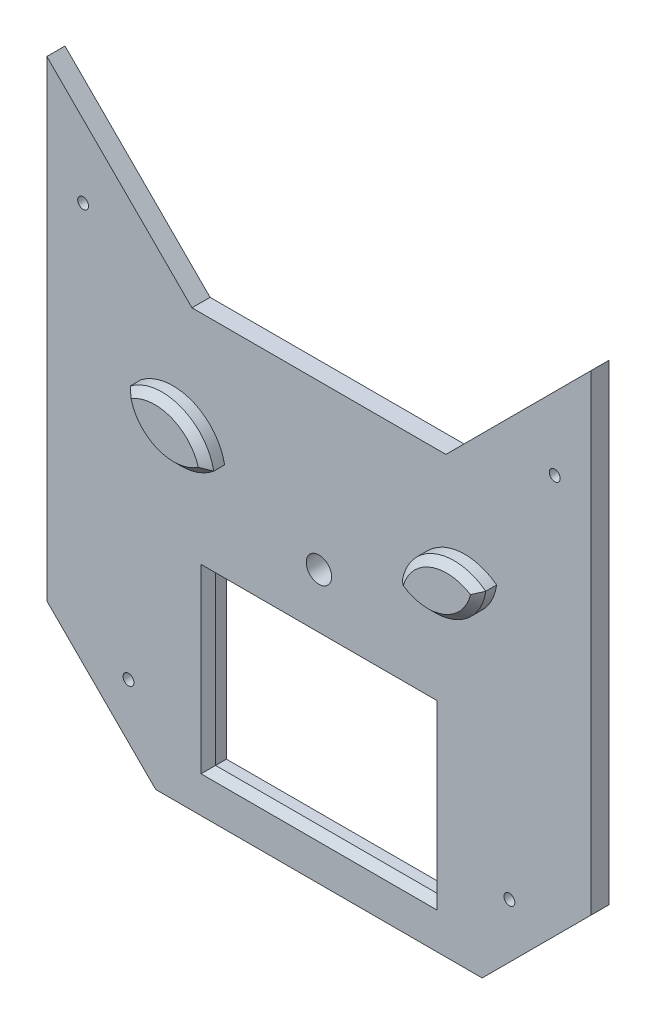
ISO-10303-21;
HEADER;
FILE_DESCRIPTION(('STEP AP214'),'2;1');
FILE_NAME('part.step','',(''),(''),'','','');
FILE_SCHEMA(('AUTOMOTIVE_DESIGN { 1 0 10303 214 1 1 1 1 }'));
ENDSEC;
DATA;
#1=APPLICATION_CONTEXT('core data for automotive mechanical design processes');
#2=APPLICATION_PROTOCOL_DEFINITION('international standard','automotive_design',2000,#1);
#3=PRODUCT_CONTEXT('',#1,'mechanical');
#4=PRODUCT('Part','Part','',(#3));
#5=PRODUCT_RELATED_PRODUCT_CATEGORY('part','',(#4));
#6=PRODUCT_DEFINITION_FORMATION('','',#4);
#7=PRODUCT_DEFINITION_CONTEXT('part definition',#1,'design');
#8=PRODUCT_DEFINITION('design','',#6,#7);
#9=PRODUCT_DEFINITION_SHAPE('','',#8);
#10=(LENGTH_UNIT() NAMED_UNIT(*) SI_UNIT(.MILLI.,.METRE.));
#11=(NAMED_UNIT(*) PLANE_ANGLE_UNIT() SI_UNIT($,.RADIAN.));
#12=(NAMED_UNIT(*) SI_UNIT($,.STERADIAN.) SOLID_ANGLE_UNIT());
#13=UNCERTAINTY_MEASURE_WITH_UNIT(LENGTH_MEASURE(1.E-05),#10,'distance_accuracy_value','');
#14=(GEOMETRIC_REPRESENTATION_CONTEXT(3) GLOBAL_UNCERTAINTY_ASSIGNED_CONTEXT((#13)) GLOBAL_UNIT_ASSIGNED_CONTEXT((#10,
#11,#12)) REPRESENTATION_CONTEXT('',''));
#15=CARTESIAN_POINT('',(0.,0.,0.));
#16=DIRECTION('',(0.,0.,1.));
#17=DIRECTION('',(1.,0.,0.));
#18=AXIS2_PLACEMENT_3D('',#15,#16,#17);
#19=CARTESIAN_POINT('',(0.,0.,5.));
#20=DIRECTION('',(0.,0.,-1.));
#21=DIRECTION('',(-1.,0.,0.));
#22=AXIS2_PLACEMENT_3D('',#19,#20,#21);
#23=PLANE('',#22);
#24=CARTESIAN_POINT('',(-52.5,-27.5,5.));
#25=DIRECTION('',(0.,0.,1.));
#26=DIRECTION('',(1.,0.,0.));
#27=AXIS2_PLACEMENT_3D('',#24,#25,#26);
#28=CIRCLE('',#27,1.5);
#29=CARTESIAN_POINT('',(-51.,-27.5,5.));
#30=VERTEX_POINT('',#29);
#31=EDGE_CURVE('E222',#30,#30,#28,.T.);
#32=ORIENTED_EDGE('',*,*,#31,.F.);
#33=EDGE_LOOP('',(#32));
#34=FACE_BOUND('',#33,.T.);
#35=CARTESIAN_POINT('',(65.0000000000002,80.,5.));
#36=DIRECTION('',(0.,0.,-1.));
#37=DIRECTION('',(-1.,0.,0.));
#38=AXIS2_PLACEMENT_3D('',#35,#36,#37);
#39=CIRCLE('',#38,1.5);
#40=CARTESIAN_POINT('',(63.5000000000002,80.,5.));
#41=VERTEX_POINT('',#40);
#42=EDGE_CURVE('E565',#41,#41,#39,.T.);
#43=ORIENTED_EDGE('',*,*,#42,.T.);
#44=EDGE_LOOP('',(#43));
#45=FACE_BOUND('',#44,.T.);
#46=DIRECTION('',(1.,0.,0.));
#47=VECTOR('',#46,1.);
#48=CARTESIAN_POINT('',(30.5,10.,5.));
#49=LINE('',#48,#47);
#50=CARTESIAN_POINT('',(-32.5,10.,5.));
#51=VERTEX_POINT('',#50);
#52=CARTESIAN_POINT('',(32.5,10.,5.));
#53=VERTEX_POINT('',#52);
#54=EDGE_CURVE('E436',#51,#53,#49,.T.);
#55=ORIENTED_EDGE('',*,*,#54,.T.);
#56=DIRECTION('',(0.,-1.,0.));
#57=VECTOR('',#56,1.);
#58=CARTESIAN_POINT('',(32.5,-38.,5.));
#59=LINE('',#58,#57);
#60=CARTESIAN_POINT('',(32.5,-40.,5.));
#61=VERTEX_POINT('',#60);
#62=EDGE_CURVE('E445',#53,#61,#59,.T.);
#63=ORIENTED_EDGE('',*,*,#62,.T.);
#64=DIRECTION('',(-1.,0.,0.));
#65=VECTOR('',#64,1.);
#66=CARTESIAN_POINT('',(-30.5,-40.,5.));
#67=LINE('',#66,#65);
#68=CARTESIAN_POINT('',(-32.5,-40.,5.));
#69=VERTEX_POINT('',#68);
#70=EDGE_CURVE('E442',#61,#69,#67,.T.);
#71=ORIENTED_EDGE('',*,*,#70,.T.);
#72=DIRECTION('',(0.,1.,0.));
#73=VECTOR('',#72,1.);
#74=CARTESIAN_POINT('',(-32.5,8.00000000000003,5.));
#75=LINE('',#74,#73);
#76=EDGE_CURVE('E439',#69,#51,#75,.T.);
#77=ORIENTED_EDGE('',*,*,#76,.T.);
#78=EDGE_LOOP('',(#55,#63,#71,#77));
#79=FACE_BOUND('',#78,.T.);
#80=CARTESIAN_POINT('',(0.,25.,5.));
#81=DIRECTION('',(0.,0.,1.));
#82=DIRECTION('',(1.,0.,0.));
#83=AXIS2_PLACEMENT_3D('',#80,#81,#82);
#84=CIRCLE('',#83,3.5);
#85=CARTESIAN_POINT('',(3.50000000000001,25.,5.));
#86=VERTEX_POINT('',#85);
#87=EDGE_CURVE('E196',#86,#86,#84,.T.);
#88=ORIENTED_EDGE('',*,*,#87,.F.);
#89=EDGE_LOOP('',(#88));
#90=FACE_BOUND('',#89,.T.);
#91=CARTESIAN_POINT('',(40.2421070756714,34.2774302497248,5.));
#92=DIRECTION('',(0.,0.,1.));
#93=DIRECTION('',(-1.,0.,0.));
#94=AXIS2_PLACEMENT_3D('',#91,#92,#93);
#95=CIRCLE('',#94,14.5000000000001);
#96=CARTESIAN_POINT('',(49.,45.8337839794267,5.));
#97=VERTEX_POINT('',#96);
#98=CARTESIAN_POINT('',(26.,37.,5.));
#99=VERTEX_POINT('',#98);
#100=EDGE_CURVE('E187',#97,#99,#95,.T.);
#101=ORIENTED_EDGE('',*,*,#100,.F.);
#102=CARTESIAN_POINT('',(35.0432527727272,47.8133791982382,5.));
#103=DIRECTION('',(0.,0.,1.));
#104=DIRECTION('',(1.,0.,0.));
#105=AXIS2_PLACEMENT_3D('',#102,#103,#104);
#106=CIRCLE('',#105,14.0964389260667);
#107=EDGE_CURVE('E190',#99,#97,#106,.T.);
#108=ORIENTED_EDGE('',*,*,#107,.F.);
#109=EDGE_LOOP('',(#101,#108));
#110=FACE_BOUND('',#109,.T.);
#111=DIRECTION('',(0.,1.,0.));
#112=VECTOR('',#111,1.);
#113=CARTESIAN_POINT('',(75.,70.,5.));
#114=LINE('',#113,#112);
#115=CARTESIAN_POINT('',(75.0000000000001,-19.9999999999999,5.));
#116=VERTEX_POINT('',#115);
#117=CARTESIAN_POINT('',(75.,110.,5.));
#118=VERTEX_POINT('',#117);
#119=EDGE_CURVE('E271',#116,#118,#114,.T.);
#120=ORIENTED_EDGE('',*,*,#119,.T.);
#121=DIRECTION('',(-0.707106781186545,-0.70710678118655,0.));
#122=VECTOR('',#121,1.);
#123=CARTESIAN_POINT('',(75.,110.,5.));
#124=LINE('',#123,#122);
#125=CARTESIAN_POINT('',(35.0000000000004,70.,5.));
#126=VERTEX_POINT('',#125);
#127=EDGE_CURVE('E275',#118,#126,#124,.T.);
#128=ORIENTED_EDGE('',*,*,#127,.T.);
#129=DIRECTION('',(-1.,0.,0.));
#130=VECTOR('',#129,1.);
#131=CARTESIAN_POINT('',(-35.0000000000004,70.0000000000001,5.));
#132=LINE('',#131,#130);
#133=CARTESIAN_POINT('',(-35.0000000000004,70.0000000000001,5.));
#134=VERTEX_POINT('',#133);
#135=EDGE_CURVE('E279',#126,#134,#132,.T.);
#136=ORIENTED_EDGE('',*,*,#135,.T.);
#137=DIRECTION('',(-0.707106781186545,0.70710678118655,0.));
#138=VECTOR('',#137,1.);
#139=CARTESIAN_POINT('',(-75.,110.,5.));
#140=LINE('',#139,#138);
#141=CARTESIAN_POINT('',(-75.,110.,5.));
#142=VERTEX_POINT('',#141);
#143=EDGE_CURVE('E282',#134,#142,#140,.T.);
#144=ORIENTED_EDGE('',*,*,#143,.T.);
#145=DIRECTION('',(0.,-1.,0.));
#146=VECTOR('',#145,1.);
#147=CARTESIAN_POINT('',(-75.,70.,5.));
#148=LINE('',#147,#146);
#149=CARTESIAN_POINT('',(-75.,-20.,5.));
#150=VERTEX_POINT('',#149);
#151=EDGE_CURVE('E285',#142,#150,#148,.T.);
#152=ORIENTED_EDGE('',*,*,#151,.T.);
#153=DIRECTION('',(0.707106781186547,-0.707106781186548,0.));
#154=VECTOR('',#153,1.);
#155=CARTESIAN_POINT('',(-75.,-20.,5.));
#156=LINE('',#155,#154);
#157=CARTESIAN_POINT('',(-45.,-50.,5.));
#158=VERTEX_POINT('',#157);
#159=EDGE_CURVE('E288',#150,#158,#156,.T.);
#160=ORIENTED_EDGE('',*,*,#159,.T.);
#161=DIRECTION('',(1.,0.,0.));
#162=VECTOR('',#161,1.);
#163=CARTESIAN_POINT('',(-45.,-50.,5.));
#164=LINE('',#163,#162);
#165=CARTESIAN_POINT('',(45.0000000000001,-50.,5.));
#166=VERTEX_POINT('',#165);
#167=EDGE_CURVE('E291',#158,#166,#164,.T.);
#168=ORIENTED_EDGE('',*,*,#167,.T.);
#169=DIRECTION('',(0.707106781186547,0.707106781186548,0.));
#170=VECTOR('',#169,1.);
#171=CARTESIAN_POINT('',(75.0000000000001,-19.9999999999999,5.));
#172=LINE('',#171,#170);
#173=EDGE_CURVE('E294',#166,#116,#172,.T.);
#174=ORIENTED_EDGE('',*,*,#173,.T.);
#175=EDGE_LOOP('',(#120,#128,#136,#144,#152,#160,#168,#174));
#176=FACE_BOUND('',#175,.T.);
#177=CARTESIAN_POINT('',(-35.0432527727272,47.8133791982382,5.));
#178=DIRECTION('',(0.,0.,1.));
#179=DIRECTION('',(-1.,0.,0.));
#180=AXIS2_PLACEMENT_3D('',#177,#178,#179);
#181=CIRCLE('',#180,14.0964389260667);
#182=CARTESIAN_POINT('',(-49.,45.8337839794267,5.));
#183=VERTEX_POINT('',#182);
#184=CARTESIAN_POINT('',(-26.,37.,5.));
#185=VERTEX_POINT('',#184);
#186=EDGE_CURVE('E206',#183,#185,#181,.T.);
#187=ORIENTED_EDGE('',*,*,#186,.F.);
#188=CARTESIAN_POINT('',(-40.2421070756713,34.2774302497248,5.));
#189=DIRECTION('',(0.,0.,1.));
#190=DIRECTION('',(1.,0.,0.));
#191=AXIS2_PLACEMENT_3D('',#188,#189,#190);
#192=CIRCLE('',#191,14.5);
#193=EDGE_CURVE('E266',#185,#183,#192,.T.);
#194=ORIENTED_EDGE('',*,*,#193,.F.);
#195=EDGE_LOOP('',(#187,#194));
#196=FACE_BOUND('',#195,.T.);
#197=CARTESIAN_POINT('',(52.5000000000001,-27.4999999999999,5.));
#198=DIRECTION('',(0.,0.,-1.));
#199=DIRECTION('',(-1.,0.,0.));
#200=AXIS2_PLACEMENT_3D('',#197,#198,#199);
#201=CIRCLE('',#200,1.5);
#202=CARTESIAN_POINT('',(51.0000000000001,-27.4999999999999,5.));
#203=VERTEX_POINT('',#202);
#204=EDGE_CURVE('E561',#203,#203,#201,.T.);
#205=ORIENTED_EDGE('',*,*,#204,.T.);
#206=EDGE_LOOP('',(#205));
#207=FACE_BOUND('',#206,.T.);
#208=CARTESIAN_POINT('',(-65.0000000000002,80.,5.));
#209=DIRECTION('',(0.,0.,1.));
#210=DIRECTION('',(1.,0.,0.));
#211=AXIS2_PLACEMENT_3D('',#208,#209,#210);
#212=CIRCLE('',#211,1.5);
#213=CARTESIAN_POINT('',(-63.5000000000002,80.,5.));
#214=VERTEX_POINT('',#213);
#215=EDGE_CURVE('E473',#214,#214,#212,.T.);
#216=ORIENTED_EDGE('',*,*,#215,.F.);
#217=EDGE_LOOP('',(#216));
#218=FACE_BOUND('',#217,.T.);
#219=ADVANCED_FACE('F49',(#34,#45,#79,#90,#110,#176,#196,#207,#218),#23,.F.);
#220=CARTESIAN_POINT('',(0.,0.,0.));
#221=DIRECTION('',(0.,0.,-1.));
#222=DIRECTION('',(-1.,0.,0.));
#223=AXIS2_PLACEMENT_3D('',#220,#221,#222);
#224=PLANE('',#223);
#225=CARTESIAN_POINT('',(52.5000000000001,-27.4999999999999,0.));
#226=DIRECTION('',(0.,0.,-1.));
#227=DIRECTION('',(-1.,0.,0.));
#228=AXIS2_PLACEMENT_3D('',#225,#226,#227);
#229=CIRCLE('',#228,1.5);
#230=CARTESIAN_POINT('',(51.0000000000001,-27.4999999999999,0.));
#231=VERTEX_POINT('',#230);
#232=EDGE_CURVE('E476',#231,#231,#229,.F.);
#233=ORIENTED_EDGE('',*,*,#232,.T.);
#234=EDGE_LOOP('',(#233));
#235=FACE_BOUND('',#234,.T.);
#236=CARTESIAN_POINT('',(65.0000000000002,80.,0.));
#237=DIRECTION('',(0.,0.,-1.));
#238=DIRECTION('',(-1.,0.,0.));
#239=AXIS2_PLACEMENT_3D('',#236,#237,#238);
#240=CIRCLE('',#239,1.5);
#241=CARTESIAN_POINT('',(63.5000000000002,80.,0.));
#242=VERTEX_POINT('',#241);
#243=EDGE_CURVE('E468',#242,#242,#240,.F.);
#244=ORIENTED_EDGE('',*,*,#243,.T.);
#245=EDGE_LOOP('',(#244));
#246=FACE_BOUND('',#245,.T.);
#247=DIRECTION('',(-0.707106781186545,-0.70710678118655,0.));
#248=VECTOR('',#247,1.);
#249=CARTESIAN_POINT('',(75.,110.,0.));
#250=LINE('',#249,#248);
#251=CARTESIAN_POINT('',(75.,110.,0.));
#252=VERTEX_POINT('',#251);
#253=CARTESIAN_POINT('',(35.0000000000004,70.,0.));
#254=VERTEX_POINT('',#253);
#255=EDGE_CURVE('E270',#252,#254,#250,.T.);
#256=ORIENTED_EDGE('',*,*,#255,.F.);
#257=DIRECTION('',(0.,1.,0.));
#258=VECTOR('',#257,1.);
#259=CARTESIAN_POINT('',(75.0000000000001,-19.9999999999999,0.));
#260=LINE('',#259,#258);
#261=CARTESIAN_POINT('',(75.0000000000001,-19.9999999999999,0.));
#262=VERTEX_POINT('',#261);
#263=EDGE_CURVE('E276',#262,#252,#260,.T.);
#264=ORIENTED_EDGE('',*,*,#263,.F.);
#265=DIRECTION('',(0.707106781186547,0.707106781186548,0.));
#266=VECTOR('',#265,1.);
#267=CARTESIAN_POINT('',(75.0000000000001,-19.9999999999999,0.));
#268=LINE('',#267,#266);
#269=CARTESIAN_POINT('',(45.0000000000001,-50.,0.));
#270=VERTEX_POINT('',#269);
#271=EDGE_CURVE('E317',#270,#262,#268,.T.);
#272=ORIENTED_EDGE('',*,*,#271,.F.);
#273=DIRECTION('',(1.,0.,0.));
#274=VECTOR('',#273,1.);
#275=CARTESIAN_POINT('',(-45.,-50.,0.));
#276=LINE('',#275,#274);
#277=CARTESIAN_POINT('',(-45.,-50.,0.));
#278=VERTEX_POINT('',#277);
#279=EDGE_CURVE('E314',#278,#270,#276,.T.);
#280=ORIENTED_EDGE('',*,*,#279,.F.);
#281=DIRECTION('',(0.707106781186547,-0.707106781186548,0.));
#282=VECTOR('',#281,1.);
#283=CARTESIAN_POINT('',(-75.,-20.,0.));
#284=LINE('',#283,#282);
#285=CARTESIAN_POINT('',(-75.,-20.,0.));
#286=VERTEX_POINT('',#285);
#287=EDGE_CURVE('E311',#286,#278,#284,.T.);
#288=ORIENTED_EDGE('',*,*,#287,.F.);
#289=DIRECTION('',(0.,-1.,0.));
#290=VECTOR('',#289,1.);
#291=CARTESIAN_POINT('',(-75.,-20.,0.));
#292=LINE('',#291,#290);
#293=CARTESIAN_POINT('',(-75.,110.,0.));
#294=VERTEX_POINT('',#293);
#295=EDGE_CURVE('E308',#294,#286,#292,.T.);
#296=ORIENTED_EDGE('',*,*,#295,.F.);
#297=DIRECTION('',(-0.707106781186545,0.70710678118655,0.));
#298=VECTOR('',#297,1.);
#299=CARTESIAN_POINT('',(-75.,110.,0.));
#300=LINE('',#299,#298);
#301=CARTESIAN_POINT('',(-35.0000000000004,70.0000000000001,0.));
#302=VERTEX_POINT('',#301);
#303=EDGE_CURVE('E304',#302,#294,#300,.T.);
#304=ORIENTED_EDGE('',*,*,#303,.F.);
#305=DIRECTION('',(-1.,0.,0.));
#306=VECTOR('',#305,1.);
#307=CARTESIAN_POINT('',(-35.0000000000004,70.0000000000001,0.));
#308=LINE('',#307,#306);
#309=EDGE_CURVE('E301',#254,#302,#308,.T.);
#310=ORIENTED_EDGE('',*,*,#309,.F.);
#311=EDGE_LOOP('',(#256,#264,#272,#280,#288,#296,#304,#310));
#312=FACE_BOUND('',#311,.T.);
#313=CARTESIAN_POINT('',(0.,25.,0.));
#314=DIRECTION('',(0.,0.,1.));
#315=DIRECTION('',(1.,0.,0.));
#316=AXIS2_PLACEMENT_3D('',#313,#314,#315);
#317=CIRCLE('',#316,3.5);
#318=CARTESIAN_POINT('',(3.50000000000001,25.,0.));
#319=VERTEX_POINT('',#318);
#320=EDGE_CURVE('E256',#319,#319,#317,.T.);
#321=ORIENTED_EDGE('',*,*,#320,.T.);
#322=EDGE_LOOP('',(#321));
#323=FACE_BOUND('',#322,.T.);
#324=DIRECTION('',(1.,0.,0.));
#325=VECTOR('',#324,1.);
#326=CARTESIAN_POINT('',(-30.5,-38.,0.));
#327=LINE('',#326,#325);
#328=CARTESIAN_POINT('',(-30.5,-38.,0.));
#329=VERTEX_POINT('',#328);
#330=CARTESIAN_POINT('',(30.5,-38.,0.));
#331=VERTEX_POINT('',#330);
#332=EDGE_CURVE('E240',#329,#331,#327,.T.);
#333=ORIENTED_EDGE('',*,*,#332,.T.);
#334=DIRECTION('',(0.,1.,0.));
#335=VECTOR('',#334,1.);
#336=CARTESIAN_POINT('',(30.5,-38.,0.));
#337=LINE('',#336,#335);
#338=CARTESIAN_POINT('',(30.5,8.00000000000003,0.));
#339=VERTEX_POINT('',#338);
#340=EDGE_CURVE('E227',#331,#339,#337,.T.);
#341=ORIENTED_EDGE('',*,*,#340,.T.);
#342=DIRECTION('',(-1.,0.,0.));
#343=VECTOR('',#342,1.);
#344=CARTESIAN_POINT('',(-30.5,8.00000000000003,0.));
#345=LINE('',#344,#343);
#346=CARTESIAN_POINT('',(-30.5,8.00000000000003,0.));
#347=VERTEX_POINT('',#346);
#348=EDGE_CURVE('E232',#339,#347,#345,.T.);
#349=ORIENTED_EDGE('',*,*,#348,.T.);
#350=DIRECTION('',(0.,-1.,0.));
#351=VECTOR('',#350,1.);
#352=CARTESIAN_POINT('',(-30.5,-38.,0.));
#353=LINE('',#352,#351);
#354=EDGE_CURVE('E236',#347,#329,#353,.T.);
#355=ORIENTED_EDGE('',*,*,#354,.T.);
#356=EDGE_LOOP('',(#333,#341,#349,#355));
#357=FACE_BOUND('',#356,.T.);
#358=CARTESIAN_POINT('',(-52.5,-27.5,0.));
#359=DIRECTION('',(0.,0.,-1.));
#360=DIRECTION('',(-1.,0.,0.));
#361=AXIS2_PLACEMENT_3D('',#358,#359,#360);
#362=CIRCLE('',#361,1.5);
#363=CARTESIAN_POINT('',(-54.,-27.5,0.));
#364=VERTEX_POINT('',#363);
#365=EDGE_CURVE('E472',#364,#364,#362,.T.);
#366=ORIENTED_EDGE('',*,*,#365,.F.);
#367=EDGE_LOOP('',(#366));
#368=FACE_BOUND('',#367,.T.);
#369=CARTESIAN_POINT('',(-65.0000000000002,80.,0.));
#370=DIRECTION('',(0.,0.,-1.));
#371=DIRECTION('',(-1.,0.,0.));
#372=AXIS2_PLACEMENT_3D('',#369,#370,#371);
#373=CIRCLE('',#372,1.5);
#374=CARTESIAN_POINT('',(-66.5000000000002,80.,0.));
#375=VERTEX_POINT('',#374);
#376=EDGE_CURVE('E54',#375,#375,#373,.T.);
#377=ORIENTED_EDGE('',*,*,#376,.F.);
#378=EDGE_LOOP('',(#377));
#379=FACE_BOUND('',#378,.T.);
#380=ADVANCED_FACE('F488',(#235,#246,#312,#323,#357,#368,#379),#224,.T.);
#381=CARTESIAN_POINT('',(75.,110.,5.));
#382=DIRECTION('',(0.70710678118655,-0.707106781186545,0.));
#383=DIRECTION('',(0.707106781186545,0.70710678118655,0.));
#384=AXIS2_PLACEMENT_3D('',#381,#382,#383);
#385=PLANE('',#384);
#386=ORIENTED_EDGE('',*,*,#255,.T.);
#387=DIRECTION('',(0.,0.,-1.));
#388=VECTOR('',#387,1.);
#389=CARTESIAN_POINT('',(35.0000000000004,70.,5.));
#390=LINE('',#389,#388);
#391=EDGE_CURVE('E345',#126,#254,#390,.T.);
#392=ORIENTED_EDGE('',*,*,#391,.F.);
#393=ORIENTED_EDGE('',*,*,#127,.F.);
#394=DIRECTION('',(0.,0.,-1.));
#395=VECTOR('',#394,1.);
#396=CARTESIAN_POINT('',(75.,110.,5.));
#397=LINE('',#396,#395);
#398=EDGE_CURVE('E349',#118,#252,#397,.T.);
#399=ORIENTED_EDGE('',*,*,#398,.T.);
#400=EDGE_LOOP('',(#386,#392,#393,#399));
#401=FACE_BOUND('',#400,.T.);
#402=ADVANCED_FACE('F490',(#401),#385,.F.);
#403=CARTESIAN_POINT('',(-35.0000000000004,70.0000000000001,5.));
#404=DIRECTION('',(0.,-1.,0.));
#405=DIRECTION('',(1.,0.,0.));
#406=AXIS2_PLACEMENT_3D('',#403,#404,#405);
#407=PLANE('',#406);
#408=ORIENTED_EDGE('',*,*,#309,.T.);
#409=DIRECTION('',(0.,0.,-1.));
#410=VECTOR('',#409,1.);
#411=CARTESIAN_POINT('',(-35.0000000000004,70.0000000000001,5.));
#412=LINE('',#411,#410);
#413=EDGE_CURVE('E341',#134,#302,#412,.T.);
#414=ORIENTED_EDGE('',*,*,#413,.F.);
#415=ORIENTED_EDGE('',*,*,#135,.F.);
#416=ORIENTED_EDGE('',*,*,#391,.T.);
#417=EDGE_LOOP('',(#408,#414,#415,#416));
#418=FACE_BOUND('',#417,.T.);
#419=ADVANCED_FACE('F497',(#418),#407,.F.);
#420=CARTESIAN_POINT('',(-75.,110.,5.));
#421=DIRECTION('',(-0.70710678118655,-0.707106781186545,0.));
#422=DIRECTION('',(0.707106781186545,-0.70710678118655,0.));
#423=AXIS2_PLACEMENT_3D('',#420,#421,#422);
#424=PLANE('',#423);
#425=ORIENTED_EDGE('',*,*,#303,.T.);
#426=DIRECTION('',(0.,0.,-1.));
#427=VECTOR('',#426,1.);
#428=CARTESIAN_POINT('',(-75.,110.,5.));
#429=LINE('',#428,#427);
#430=EDGE_CURVE('E337',#142,#294,#429,.T.);
#431=ORIENTED_EDGE('',*,*,#430,.F.);
#432=ORIENTED_EDGE('',*,*,#143,.F.);
#433=ORIENTED_EDGE('',*,*,#413,.T.);
#434=EDGE_LOOP('',(#425,#431,#432,#433));
#435=FACE_BOUND('',#434,.T.);
#436=ADVANCED_FACE('F524',(#435),#424,.F.);
#437=CARTESIAN_POINT('',(-75.,-20.,5.));
#438=DIRECTION('',(1.,0.,0.));
#439=DIRECTION('',(0.,0.,-1.));
#440=AXIS2_PLACEMENT_3D('',#437,#438,#439);
#441=PLANE('',#440);
#442=ORIENTED_EDGE('',*,*,#295,.T.);
#443=DIRECTION('',(0.,0.,-1.));
#444=VECTOR('',#443,1.);
#445=CARTESIAN_POINT('',(-75.,-20.,5.));
#446=LINE('',#445,#444);
#447=EDGE_CURVE('E333',#150,#286,#446,.T.);
#448=ORIENTED_EDGE('',*,*,#447,.F.);
#449=ORIENTED_EDGE('',*,*,#151,.F.);
#450=ORIENTED_EDGE('',*,*,#430,.T.);
#451=EDGE_LOOP('',(#442,#448,#449,#450));
#452=FACE_BOUND('',#451,.T.);
#453=ADVANCED_FACE('F520',(#452),#441,.F.);
#454=CARTESIAN_POINT('',(-75.,-20.,5.));
#455=DIRECTION('',(0.707106781186548,0.707106781186547,0.));
#456=DIRECTION('',(-0.707106781186547,0.707106781186548,0.));
#457=AXIS2_PLACEMENT_3D('',#454,#455,#456);
#458=PLANE('',#457);
#459=ORIENTED_EDGE('',*,*,#287,.T.);
#460=DIRECTION('',(0.,0.,-1.));
#461=VECTOR('',#460,1.);
#462=CARTESIAN_POINT('',(-45.,-50.,5.));
#463=LINE('',#462,#461);
#464=EDGE_CURVE('E329',#158,#278,#463,.T.);
#465=ORIENTED_EDGE('',*,*,#464,.F.);
#466=ORIENTED_EDGE('',*,*,#159,.F.);
#467=ORIENTED_EDGE('',*,*,#447,.T.);
#468=EDGE_LOOP('',(#459,#465,#466,#467));
#469=FACE_BOUND('',#468,.T.);
#470=ADVANCED_FACE('F516',(#469),#458,.F.);
#471=CARTESIAN_POINT('',(-45.,-50.,5.));
#472=DIRECTION('',(0.,1.,0.));
#473=DIRECTION('',(-1.,0.,0.));
#474=AXIS2_PLACEMENT_3D('',#471,#472,#473);
#475=PLANE('',#474);
#476=ORIENTED_EDGE('',*,*,#279,.T.);
#477=DIRECTION('',(0.,0.,-1.));
#478=VECTOR('',#477,1.);
#479=CARTESIAN_POINT('',(45.0000000000001,-50.,5.));
#480=LINE('',#479,#478);
#481=EDGE_CURVE('E325',#166,#270,#480,.T.);
#482=ORIENTED_EDGE('',*,*,#481,.F.);
#483=ORIENTED_EDGE('',*,*,#167,.F.);
#484=ORIENTED_EDGE('',*,*,#464,.T.);
#485=EDGE_LOOP('',(#476,#482,#483,#484));
#486=FACE_BOUND('',#485,.T.);
#487=ADVANCED_FACE('F512',(#486),#475,.F.);
#488=CARTESIAN_POINT('',(75.0000000000001,-19.9999999999999,5.));
#489=DIRECTION('',(-0.707106781186548,0.707106781186547,0.));
#490=DIRECTION('',(-0.707106781186547,-0.707106781186548,0.));
#491=AXIS2_PLACEMENT_3D('',#488,#489,#490);
#492=PLANE('',#491);
#493=ORIENTED_EDGE('',*,*,#271,.T.);
#494=DIRECTION('',(0.,0.,-1.));
#495=VECTOR('',#494,1.);
#496=CARTESIAN_POINT('',(75.0000000000001,-19.9999999999999,5.));
#497=LINE('',#496,#495);
#498=EDGE_CURVE('E298',#116,#262,#497,.T.);
#499=ORIENTED_EDGE('',*,*,#498,.F.);
#500=ORIENTED_EDGE('',*,*,#173,.F.);
#501=ORIENTED_EDGE('',*,*,#481,.T.);
#502=EDGE_LOOP('',(#493,#499,#500,#501));
#503=FACE_BOUND('',#502,.T.);
#504=ADVANCED_FACE('F508',(#503),#492,.F.);
#505=CARTESIAN_POINT('',(75.0000000000001,-19.9999999999999,5.));
#506=DIRECTION('',(-1.,0.,0.));
#507=DIRECTION('',(0.,-1.,0.));
#508=AXIS2_PLACEMENT_3D('',#505,#506,#507);
#509=PLANE('',#508);
#510=ORIENTED_EDGE('',*,*,#263,.T.);
#511=ORIENTED_EDGE('',*,*,#398,.F.);
#512=ORIENTED_EDGE('',*,*,#119,.F.);
#513=ORIENTED_EDGE('',*,*,#498,.T.);
#514=EDGE_LOOP('',(#510,#511,#512,#513));
#515=FACE_BOUND('',#514,.T.);
#516=ADVANCED_FACE('F504',(#515),#509,.F.);
#517=CARTESIAN_POINT('',(0.,25.,5.));
#518=DIRECTION('',(0.,0.,-1.));
#519=DIRECTION('',(-1.,0.,0.));
#520=AXIS2_PLACEMENT_3D('',#517,#518,#519);
#521=CYLINDRICAL_SURFACE('',#520,3.5);
#522=ORIENTED_EDGE('',*,*,#87,.T.);
#523=EDGE_LOOP('',(#522));
#524=FACE_BOUND('',#523,.T.);
#525=ORIENTED_EDGE('',*,*,#320,.F.);
#526=EDGE_LOOP('',(#525));
#527=FACE_BOUND('',#526,.T.);
#528=ADVANCED_FACE('F507',(#524,#527),#521,.F.);
#529=CARTESIAN_POINT('',(30.5,-38.,5.));
#530=DIRECTION('',(-1.,0.,0.));
#531=DIRECTION('',(0.,0.,1.));
#532=AXIS2_PLACEMENT_3D('',#529,#530,#531);
#533=PLANE('',#532);
#534=DIRECTION('',(0.,0.,-1.));
#535=VECTOR('',#534,1.);
#536=CARTESIAN_POINT('',(30.5,-38.,5.));
#537=LINE('',#536,#535);
#538=CARTESIAN_POINT('',(30.5,-38.,3.));
#539=VERTEX_POINT('',#538);
#540=EDGE_CURVE('E244',#539,#331,#537,.T.);
#541=ORIENTED_EDGE('',*,*,#540,.F.);
#542=DIRECTION('',(0.,1.,0.));
#543=VECTOR('',#542,1.);
#544=CARTESIAN_POINT('',(30.5,8.00000000000003,3.));
#545=LINE('',#544,#543);
#546=CARTESIAN_POINT('',(30.5,8.00000000000003,3.));
#547=VERTEX_POINT('',#546);
#548=EDGE_CURVE('E379',#539,#547,#545,.T.);
#549=ORIENTED_EDGE('',*,*,#548,.T.);
#550=DIRECTION('',(0.,0.,-1.));
#551=VECTOR('',#550,1.);
#552=CARTESIAN_POINT('',(30.5,8.00000000000003,5.));
#553=LINE('',#552,#551);
#554=EDGE_CURVE('E253',#547,#339,#553,.T.);
#555=ORIENTED_EDGE('',*,*,#554,.T.);
#556=ORIENTED_EDGE('',*,*,#340,.F.);
#557=EDGE_LOOP('',(#541,#549,#555,#556));
#558=FACE_BOUND('',#557,.T.);
#559=ADVANCED_FACE('F586',(#558),#533,.T.);
#560=CARTESIAN_POINT('',(-30.5,8.00000000000003,5.));
#561=DIRECTION('',(0.,-1.,0.));
#562=DIRECTION('',(0.,0.,-1.));
#563=AXIS2_PLACEMENT_3D('',#560,#561,#562);
#564=PLANE('',#563);
#565=ORIENTED_EDGE('',*,*,#554,.F.);
#566=DIRECTION('',(-1.,0.,0.));
#567=VECTOR('',#566,1.);
#568=CARTESIAN_POINT('',(-30.5,8.00000000000003,3.));
#569=LINE('',#568,#567);
#570=CARTESIAN_POINT('',(-30.5,8.00000000000003,3.));
#571=VERTEX_POINT('',#570);
#572=EDGE_CURVE('E11',#547,#571,#569,.T.);
#573=ORIENTED_EDGE('',*,*,#572,.T.);
#574=DIRECTION('',(0.,0.,-1.));
#575=VECTOR('',#574,1.);
#576=CARTESIAN_POINT('',(-30.5,8.00000000000003,5.));
#577=LINE('',#576,#575);
#578=EDGE_CURVE('E250',#571,#347,#577,.T.);
#579=ORIENTED_EDGE('',*,*,#578,.T.);
#580=ORIENTED_EDGE('',*,*,#348,.F.);
#581=EDGE_LOOP('',(#565,#573,#579,#580));
#582=FACE_BOUND('',#581,.T.);
#583=ADVANCED_FACE('F633',(#582),#564,.T.);
#584=CARTESIAN_POINT('',(-30.5,-38.,5.));
#585=DIRECTION('',(1.,0.,0.));
#586=DIRECTION('',(0.,0.,-1.));
#587=AXIS2_PLACEMENT_3D('',#584,#585,#586);
#588=PLANE('',#587);
#589=ORIENTED_EDGE('',*,*,#578,.F.);
#590=DIRECTION('',(0.,-1.,0.));
#591=VECTOR('',#590,1.);
#592=CARTESIAN_POINT('',(-30.5,-38.,3.));
#593=LINE('',#592,#591);
#594=CARTESIAN_POINT('',(-30.5,-38.,3.));
#595=VERTEX_POINT('',#594);
#596=EDGE_CURVE('E60',#571,#595,#593,.T.);
#597=ORIENTED_EDGE('',*,*,#596,.T.);
#598=DIRECTION('',(0.,0.,-1.));
#599=VECTOR('',#598,1.);
#600=CARTESIAN_POINT('',(-30.5,-38.,5.));
#601=LINE('',#600,#599);
#602=EDGE_CURVE('E247',#595,#329,#601,.T.);
#603=ORIENTED_EDGE('',*,*,#602,.T.);
#604=ORIENTED_EDGE('',*,*,#354,.F.);
#605=EDGE_LOOP('',(#589,#597,#603,#604));
#606=FACE_BOUND('',#605,.T.);
#607=ADVANCED_FACE('F629',(#606),#588,.T.);
#608=CARTESIAN_POINT('',(-30.5,-38.,5.));
#609=DIRECTION('',(0.,1.,0.));
#610=DIRECTION('',(0.,0.,1.));
#611=AXIS2_PLACEMENT_3D('',#608,#609,#610);
#612=PLANE('',#611);
#613=ORIENTED_EDGE('',*,*,#602,.F.);
#614=DIRECTION('',(1.,0.,0.));
#615=VECTOR('',#614,1.);
#616=CARTESIAN_POINT('',(30.5,-38.,3.));
#617=LINE('',#616,#615);
#618=EDGE_CURVE('E449',#595,#539,#617,.T.);
#619=ORIENTED_EDGE('',*,*,#618,.T.);
#620=ORIENTED_EDGE('',*,*,#540,.T.);
#621=ORIENTED_EDGE('',*,*,#332,.F.);
#622=EDGE_LOOP('',(#613,#619,#620,#621));
#623=FACE_BOUND('',#622,.T.);
#624=ADVANCED_FACE('F622',(#623),#612,.T.);
#625=CARTESIAN_POINT('',(-40.2421070756713,34.2774302497248,0.));
#626=DIRECTION('',(0.,0.,1.));
#627=DIRECTION('',(1.,0.,0.));
#628=AXIS2_PLACEMENT_3D('',#625,#626,#627);
#629=CYLINDRICAL_SURFACE('',#628,14.5);
#630=DIRECTION('',(0.,0.,1.));
#631=VECTOR('',#630,1.);
#632=CARTESIAN_POINT('',(-49.,45.8337839794267,0.));
#633=LINE('',#632,#631);
#634=CARTESIAN_POINT('',(-49.,45.8337839794267,7.99999999999996));
#635=VERTEX_POINT('',#634);
#636=EDGE_CURVE('E217',#183,#635,#633,.T.);
#637=ORIENTED_EDGE('',*,*,#636,.T.);
#638=CARTESIAN_POINT('',(-40.2421070756713,34.2774302497248,7.99999999999996));
#639=DIRECTION('',(0.,0.,1.));
#640=DIRECTION('',(1.,0.,0.));
#641=AXIS2_PLACEMENT_3D('',#638,#639,#640);
#642=CIRCLE('',#641,14.5);
#643=CARTESIAN_POINT('',(-26.,37.,7.99999999999996));
#644=VERTEX_POINT('',#643);
#645=EDGE_CURVE('E376',#635,#644,#642,.F.);
#646=ORIENTED_EDGE('',*,*,#645,.T.);
#647=DIRECTION('',(0.,0.,1.));
#648=VECTOR('',#647,1.);
#649=CARTESIAN_POINT('',(-26.,37.,0.));
#650=LINE('',#649,#648);
#651=EDGE_CURVE('E212',#185,#644,#650,.T.);
#652=ORIENTED_EDGE('',*,*,#651,.F.);
#653=ORIENTED_EDGE('',*,*,#193,.T.);
#654=EDGE_LOOP('',(#637,#646,#652,#653));
#655=FACE_BOUND('',#654,.T.);
#656=ADVANCED_FACE('F619',(#655),#629,.T.);
#657=CARTESIAN_POINT('',(-35.0432527727272,47.8133791982382,0.));
#658=DIRECTION('',(0.,0.,1.));
#659=DIRECTION('',(1.,0.,0.));
#660=AXIS2_PLACEMENT_3D('',#657,#658,#659);
#661=CYLINDRICAL_SURFACE('',#660,14.0964389260667);
#662=ORIENTED_EDGE('',*,*,#651,.T.);
#663=CARTESIAN_POINT('',(-35.0432527727272,47.8133791982382,7.99999999999996));
#664=DIRECTION('',(0.,0.,1.));
#665=DIRECTION('',(1.,0.,0.));
#666=AXIS2_PLACEMENT_3D('',#663,#664,#665);
#667=CIRCLE('',#666,14.0964389260667);
#668=EDGE_CURVE('E365',#644,#635,#667,.F.);
#669=ORIENTED_EDGE('',*,*,#668,.T.);
#670=ORIENTED_EDGE('',*,*,#636,.F.);
#671=ORIENTED_EDGE('',*,*,#186,.T.);
#672=EDGE_LOOP('',(#662,#669,#670,#671));
#673=FACE_BOUND('',#672,.T.);
#674=ADVANCED_FACE('F617',(#673),#661,.T.);
#675=CARTESIAN_POINT('',(0.,0.,10.));
#676=DIRECTION('',(0.,0.,1.));
#677=DIRECTION('',(1.,0.,0.));
#678=AXIS2_PLACEMENT_3D('',#675,#676,#677);
#679=PLANE('',#678);
#680=CARTESIAN_POINT('',(-40.2421070756713,34.2774302497248,10.));
#681=DIRECTION('',(0.,0.,1.));
#682=DIRECTION('',(1.,0.,0.));
#683=AXIS2_PLACEMENT_3D('',#680,#681,#682);
#684=CIRCLE('',#683,12.5);
#685=CARTESIAN_POINT('',(-28.2500555113733,37.8045677972578,10.));
#686=VERTEX_POINT('',#685);
#687=CARTESIAN_POINT('',(-46.7898599269281,44.9252907202071,10.));
#688=VERTEX_POINT('',#687);
#689=EDGE_CURVE('E369',#686,#688,#684,.T.);
#690=ORIENTED_EDGE('',*,*,#689,.T.);
#691=CARTESIAN_POINT('',(-35.0432527727272,47.8133791982382,10.));
#692=DIRECTION('',(0.,0.,1.));
#693=DIRECTION('',(1.,0.,0.));
#694=AXIS2_PLACEMENT_3D('',#691,#692,#693);
#695=CIRCLE('',#694,12.0964389260667);
#696=EDGE_CURVE('E372',#688,#686,#695,.T.);
#697=ORIENTED_EDGE('',*,*,#696,.T.);
#698=EDGE_LOOP('',(#690,#697));
#699=FACE_BOUND('',#698,.T.);
#700=ADVANCED_FACE('F612',(#699),#679,.T.);
#701=CARTESIAN_POINT('',(35.0432527727272,47.8133791982382,0.));
#702=DIRECTION('',(0.,0.,1.));
#703=DIRECTION('',(1.,0.,0.));
#704=AXIS2_PLACEMENT_3D('',#701,#702,#703);
#705=CYLINDRICAL_SURFACE('',#704,14.0964389260667);
#706=DIRECTION('',(0.,0.,1.));
#707=VECTOR('',#706,1.);
#708=CARTESIAN_POINT('',(49.,45.8337839794267,0.));
#709=LINE('',#708,#707);
#710=CARTESIAN_POINT('',(49.,45.8337839794267,8.00000000000001));
#711=VERTEX_POINT('',#710);
#712=EDGE_CURVE('E202',#97,#711,#709,.T.);
#713=ORIENTED_EDGE('',*,*,#712,.T.);
#714=CARTESIAN_POINT('',(35.0432527727272,47.8133791982382,8.00000000000001));
#715=DIRECTION('',(0.,0.,1.));
#716=DIRECTION('',(1.,0.,0.));
#717=AXIS2_PLACEMENT_3D('',#714,#715,#716);
#718=CIRCLE('',#717,14.0964389260667);
#719=CARTESIAN_POINT('',(26.,37.,8.00000000000001));
#720=VERTEX_POINT('',#719);
#721=EDGE_CURVE('E353',#711,#720,#718,.F.);
#722=ORIENTED_EDGE('',*,*,#721,.T.);
#723=DIRECTION('',(0.,0.,1.));
#724=VECTOR('',#723,1.);
#725=CARTESIAN_POINT('',(26.,37.,0.));
#726=LINE('',#725,#724);
#727=EDGE_CURVE('E204',#99,#720,#726,.T.);
#728=ORIENTED_EDGE('',*,*,#727,.F.);
#729=ORIENTED_EDGE('',*,*,#107,.T.);
#730=EDGE_LOOP('',(#713,#722,#728,#729));
#731=FACE_BOUND('',#730,.T.);
#732=ADVANCED_FACE('F200',(#731),#705,.T.);
#733=CARTESIAN_POINT('',(40.2421070756714,34.2774302497248,0.));
#734=DIRECTION('',(0.,0.,1.));
#735=DIRECTION('',(1.,0.,0.));
#736=AXIS2_PLACEMENT_3D('',#733,#734,#735);
#737=CYLINDRICAL_SURFACE('',#736,14.5000000000001);
#738=ORIENTED_EDGE('',*,*,#727,.T.);
#739=CARTESIAN_POINT('',(40.2421070756714,34.2774302497248,8.00000000000001));
#740=DIRECTION('',(0.,0.,1.));
#741=DIRECTION('',(1.,0.,0.));
#742=AXIS2_PLACEMENT_3D('',#739,#740,#741);
#743=CIRCLE('',#742,14.5000000000001);
#744=EDGE_CURVE('E210',#720,#711,#743,.F.);
#745=ORIENTED_EDGE('',*,*,#744,.T.);
#746=ORIENTED_EDGE('',*,*,#712,.F.);
#747=ORIENTED_EDGE('',*,*,#100,.T.);
#748=EDGE_LOOP('',(#738,#745,#746,#747));
#749=FACE_BOUND('',#748,.T.);
#750=ADVANCED_FACE('F208',(#749),#737,.T.);
#751=CARTESIAN_POINT('',(0.,0.,10.));
#752=DIRECTION('',(0.,0.,1.));
#753=DIRECTION('',(1.,0.,0.));
#754=AXIS2_PLACEMENT_3D('',#751,#752,#753);
#755=PLANE('',#754);
#756=CARTESIAN_POINT('',(40.2421070756714,34.2774302497248,10.));
#757=DIRECTION('',(0.,0.,1.));
#758=DIRECTION('',(1.,0.,0.));
#759=AXIS2_PLACEMENT_3D('',#756,#757,#758);
#760=CIRCLE('',#759,12.5);
#761=CARTESIAN_POINT('',(46.7898599269282,44.9252907202071,10.));
#762=VERTEX_POINT('',#761);
#763=CARTESIAN_POINT('',(28.2500555113733,37.8045677972578,10.));
#764=VERTEX_POINT('',#763);
#765=EDGE_CURVE('E356',#762,#764,#760,.T.);
#766=ORIENTED_EDGE('',*,*,#765,.T.);
#767=CARTESIAN_POINT('',(35.0432527727272,47.8133791982382,10.));
#768=DIRECTION('',(0.,0.,1.));
#769=DIRECTION('',(1.,0.,0.));
#770=AXIS2_PLACEMENT_3D('',#767,#768,#769);
#771=CIRCLE('',#770,12.0964389260667);
#772=EDGE_CURVE('E359',#764,#762,#771,.T.);
#773=ORIENTED_EDGE('',*,*,#772,.T.);
#774=EDGE_LOOP('',(#766,#773));
#775=FACE_BOUND('',#774,.T.);
#776=ADVANCED_FACE('F606',(#775),#755,.T.);
#777=CARTESIAN_POINT('',(40.2421070756714,34.2774302497248,8.00000000000001));
#778=DIRECTION('',(0.,0.,-1.));
#779=DIRECTION('',(-1.,0.,0.));
#780=AXIS2_PLACEMENT_3D('',#777,#778,#779);
#781=CONICAL_SURFACE('',#780,14.5000000000001,0.785398163397451);
#782=CARTESIAN_POINT('',(26.,37.,8.00000000000001));
#783=CARTESIAN_POINT('',(26.1852645099029,37.0661009676871,8.16955023498767));
#784=CARTESIAN_POINT('',(26.3709990215041,37.1323999945847,8.33851207434876));
#785=CARTESIAN_POINT('',(26.7435287441057,37.2654464930768,8.67505874946414));
#786=CARTESIAN_POINT('',(26.9303238877019,37.3321939362222,8.84264367110295));
#787=CARTESIAN_POINT('',(27.3051213782924,37.4661988011587,9.17625993156357));
#788=CARTESIAN_POINT('',(27.493123741689,37.5334562298811,9.34229124920117));
#789=CARTESIAN_POINT('',(27.8705125330683,37.668556219118,9.67255795668255));
#790=CARTESIAN_POINT('',(28.0598990474103,37.7363988161904,9.83679323284483));
#791=CARTESIAN_POINT('',(28.2500555113733,37.8045677972578,10.));
#792=B_SPLINE_CURVE_WITH_KNOTS('',3,(#782,#783,#784,#785,#786,#787,#788,#789,#790,#791),
.UNSPECIFIED.,.F.,.F.,(4,2,2,2,4),(0.,0.779074876040685,1.55810078306222,2.33713729707677,
3.1162228385298),.UNSPECIFIED.);
#793=EDGE_CURVE('E380',#764,#720,#792,.F.);
#794=ORIENTED_EDGE('',*,*,#793,.F.);
#795=ORIENTED_EDGE('',*,*,#765,.F.);
#796=CARTESIAN_POINT('',(46.7898599269282,44.9252907202071,10.));
#797=CARTESIAN_POINT('',(46.9767591558176,45.0019403712645,9.83679323284483));
#798=CARTESIAN_POINT('',(47.1628679086396,45.0783170818193,9.67255795668255));
#799=CARTESIAN_POINT('',(47.5336653299481,45.2305786308115,9.34229124920117));
#800=CARTESIAN_POINT('',(47.7183540870627,45.3064634998997,9.17625993156356));
#801=CARTESIAN_POINT('',(48.0864933580375,45.4578039767912,8.84264367110295));
#802=CARTESIAN_POINT('',(48.2699438887228,45.5332595904249,8.67505874946415));
#803=CARTESIAN_POINT('',(48.6357569071869,45.6837939735568,8.33851207434876));
#804=CARTESIAN_POINT('',(48.8181193258471,45.7588727190688,8.16955023498767));
#805=CARTESIAN_POINT('',(49.,45.8337839794267,8.00000000000001));
#806=B_SPLINE_CURVE_WITH_KNOTS('',3,(#796,#797,#798,#799,#800,#801,#802,#803,#804,#805),
.UNSPECIFIED.,.F.,.F.,(4,2,2,2,4),(0.,0.779085541453038,1.55812205546758,2.3371479624891,
3.11622283852979),.UNSPECIFIED.);
#807=EDGE_CURVE('E219',#711,#762,#806,.F.);
#808=ORIENTED_EDGE('',*,*,#807,.F.);
#809=ORIENTED_EDGE('',*,*,#744,.F.);
#810=EDGE_LOOP('',(#794,#795,#808,#809));
#811=FACE_BOUND('',#810,.T.);
#812=ADVANCED_FACE('F396',(#811),#781,.T.);
#813=CARTESIAN_POINT('',(35.0432527727272,47.8133791982382,8.00000000000001));
#814=DIRECTION('',(0.,0.,-1.));
#815=DIRECTION('',(-1.,0.,0.));
#816=AXIS2_PLACEMENT_3D('',#813,#814,#815);
#817=CONICAL_SURFACE('',#816,14.0964389260667,0.785398163397451);
#818=ORIENTED_EDGE('',*,*,#807,.T.);
#819=ORIENTED_EDGE('',*,*,#772,.F.);
#820=ORIENTED_EDGE('',*,*,#793,.T.);
#821=ORIENTED_EDGE('',*,*,#721,.F.);
#822=EDGE_LOOP('',(#818,#819,#820,#821));
#823=FACE_BOUND('',#822,.T.);
#824=ADVANCED_FACE('F400',(#823),#817,.T.);
#825=CARTESIAN_POINT('',(-40.2421070756713,34.2774302497248,7.99999999999996));
#826=DIRECTION('',(0.,0.,-1.));
#827=DIRECTION('',(-1.,0.,0.));
#828=AXIS2_PLACEMENT_3D('',#825,#826,#827);
#829=CONICAL_SURFACE('',#828,14.5,0.785398163397446);
#830=CARTESIAN_POINT('',(-49.,45.8337839794267,7.99999999999996));
#831=CARTESIAN_POINT('',(-48.8181193258471,45.7588727190688,8.16955023498763));
#832=CARTESIAN_POINT('',(-48.6357569071868,45.6837939735568,8.33851207434872));
#833=CARTESIAN_POINT('',(-48.2699438887228,45.5332595904249,8.67505874946412));
#834=CARTESIAN_POINT('',(-48.0864933580375,45.4578039767912,8.84264367110292));
#835=CARTESIAN_POINT('',(-47.7183540870627,45.3064634998997,9.17625993156355));
#836=CARTESIAN_POINT('',(-47.5336653299481,45.2305786308115,9.34229124920116));
#837=CARTESIAN_POINT('',(-47.1628679086396,45.0783170818193,9.67255795668254));
#838=CARTESIAN_POINT('',(-46.9767591558175,45.0019403712645,9.83679323284483));
#839=CARTESIAN_POINT('',(-46.7898599269281,44.9252907202071,10.));
#840=B_SPLINE_CURVE_WITH_KNOTS('',3,(#830,#831,#832,#833,#834,#835,#836,#837,#838,#839),
.UNSPECIFIED.,.F.,.F.,(4,2,2,2,4),(0.,0.779074876040704,1.55810078306225,2.33713729707681,
3.11622283852986),.UNSPECIFIED.);
#841=EDGE_CURVE('E421',#688,#635,#840,.F.);
#842=ORIENTED_EDGE('',*,*,#841,.F.);
#843=ORIENTED_EDGE('',*,*,#689,.F.);
#844=CARTESIAN_POINT('',(-28.2500555113733,37.8045677972578,10.));
#845=CARTESIAN_POINT('',(-28.0598990474103,37.7363988161904,9.83679323284482));
#846=CARTESIAN_POINT('',(-27.8705125330683,37.668556219118,9.67255795668254));
#847=CARTESIAN_POINT('',(-27.493123741689,37.5334562298811,9.34229124920116));
#848=CARTESIAN_POINT('',(-27.3051213782924,37.4661988011587,9.17625993156354));
#849=CARTESIAN_POINT('',(-26.9303238877019,37.3321939362222,8.84264367110292));
#850=CARTESIAN_POINT('',(-26.7435287441057,37.2654464930768,8.67505874946411));
#851=CARTESIAN_POINT('',(-26.370999021504,37.1323999945847,8.33851207434872));
#852=CARTESIAN_POINT('',(-26.1852645099029,37.0661009676871,8.16955023498763));
#853=CARTESIAN_POINT('',(-26.,37.,7.99999999999996));
#854=B_SPLINE_CURVE_WITH_KNOTS('',3,(#844,#845,#846,#847,#848,#849,#850,#851,#852,#853),
.UNSPECIFIED.,.F.,.F.,(4,2,2,2,4),(0.,0.779085541453043,1.55812205546761,2.33714796248916,
3.11622283852985),.UNSPECIFIED.);
#855=EDGE_CURVE('E389',#644,#686,#854,.F.);
#856=ORIENTED_EDGE('',*,*,#855,.F.);
#857=ORIENTED_EDGE('',*,*,#645,.F.);
#858=EDGE_LOOP('',(#842,#843,#856,#857));
#859=FACE_BOUND('',#858,.T.);
#860=ADVANCED_FACE('F406',(#859),#829,.T.);
#861=CARTESIAN_POINT('',(-35.0432527727272,47.8133791982382,7.99999999999996));
#862=DIRECTION('',(0.,0.,-1.));
#863=DIRECTION('',(-1.,0.,0.));
#864=AXIS2_PLACEMENT_3D('',#861,#862,#863);
#865=CONICAL_SURFACE('',#864,14.0964389260667,0.785398163397446);
#866=ORIENTED_EDGE('',*,*,#855,.T.);
#867=ORIENTED_EDGE('',*,*,#696,.F.);
#868=ORIENTED_EDGE('',*,*,#841,.T.);
#869=ORIENTED_EDGE('',*,*,#668,.F.);
#870=EDGE_LOOP('',(#866,#867,#868,#869));
#871=FACE_BOUND('',#870,.T.);
#872=ADVANCED_FACE('F416',(#871),#865,.T.);
#873=CARTESIAN_POINT('',(-30.5,-38.,3.));
#874=DIRECTION('',(0.707106781186547,0.,0.707106781186547));
#875=DIRECTION('',(0.,1.,0.));
#876=AXIS2_PLACEMENT_3D('',#873,#874,#875);
#877=PLANE('',#876);
#878=DIRECTION('',(0.577350269189626,-0.577350269189626,-0.577350269189626));
#879=VECTOR('',#878,1.);
#880=CARTESIAN_POINT('',(-15.1666666666666,-7.33333333333329,-12.3333333333333));
#881=LINE('',#880,#879);
#882=EDGE_CURVE('E460',#51,#571,#881,.T.);
#883=ORIENTED_EDGE('',*,*,#882,.F.);
#884=ORIENTED_EDGE('',*,*,#76,.F.);
#885=DIRECTION('',(0.577350269189626,0.577350269189626,-0.577350269189626));
#886=VECTOR('',#885,1.);
#887=CARTESIAN_POINT('',(-30.5,-38.,3.));
#888=LINE('',#887,#886);
#889=EDGE_CURVE('E464',#595,#69,#888,.F.);
#890=ORIENTED_EDGE('',*,*,#889,.F.);
#891=ORIENTED_EDGE('',*,*,#596,.F.);
#892=EDGE_LOOP('',(#883,#884,#890,#891));
#893=FACE_BOUND('',#892,.T.);
#894=ADVANCED_FACE('F52',(#893),#877,.T.);
#895=CARTESIAN_POINT('',(-30.5,-38.,3.));
#896=DIRECTION('',(0.,0.707106781186547,0.707106781186547));
#897=DIRECTION('',(-1.,0.,0.));
#898=AXIS2_PLACEMENT_3D('',#895,#896,#897);
#899=PLANE('',#898);
#900=ORIENTED_EDGE('',*,*,#889,.T.);
#901=ORIENTED_EDGE('',*,*,#70,.F.);
#902=DIRECTION('',(-0.577350269189626,0.577350269189626,-0.577350269189626));
#903=VECTOR('',#902,1.);
#904=CARTESIAN_POINT('',(30.5,-38.,3.));
#905=LINE('',#904,#903);
#906=EDGE_CURVE('E457',#539,#61,#905,.F.);
#907=ORIENTED_EDGE('',*,*,#906,.F.);
#908=ORIENTED_EDGE('',*,*,#618,.F.);
#909=EDGE_LOOP('',(#900,#901,#907,#908));
#910=FACE_BOUND('',#909,.T.);
#911=ADVANCED_FACE('F648',(#910),#899,.T.);
#912=CARTESIAN_POINT('',(-30.5,8.00000000000003,3.));
#913=DIRECTION('',(0.,-0.707106781186547,0.707106781186547));
#914=DIRECTION('',(1.,0.,0.));
#915=AXIS2_PLACEMENT_3D('',#912,#913,#914);
#916=PLANE('',#915);
#917=ORIENTED_EDGE('',*,*,#882,.T.);
#918=ORIENTED_EDGE('',*,*,#572,.F.);
#919=DIRECTION('',(0.577350269189626,0.577350269189626,0.577350269189626));
#920=VECTOR('',#919,1.);
#921=CARTESIAN_POINT('',(15.1666666666667,-7.33333333333329,-12.3333333333333));
#922=LINE('',#921,#920);
#923=EDGE_CURVE('E454',#53,#547,#922,.F.);
#924=ORIENTED_EDGE('',*,*,#923,.F.);
#925=ORIENTED_EDGE('',*,*,#54,.F.);
#926=EDGE_LOOP('',(#917,#918,#924,#925));
#927=FACE_BOUND('',#926,.T.);
#928=ADVANCED_FACE('F652',(#927),#916,.T.);
#929=CARTESIAN_POINT('',(30.5,-38.,3.));
#930=DIRECTION('',(-0.707106781186547,0.,0.707106781186547));
#931=DIRECTION('',(0.,-1.,0.));
#932=AXIS2_PLACEMENT_3D('',#929,#930,#931);
#933=PLANE('',#932);
#934=ORIENTED_EDGE('',*,*,#906,.T.);
#935=ORIENTED_EDGE('',*,*,#62,.F.);
#936=ORIENTED_EDGE('',*,*,#923,.T.);
#937=ORIENTED_EDGE('',*,*,#548,.F.);
#938=EDGE_LOOP('',(#934,#935,#936,#937));
#939=FACE_BOUND('',#938,.T.);
#940=ADVANCED_FACE('F602',(#939),#933,.T.);
#941=CARTESIAN_POINT('',(65.0000000000002,80.,-5.));
#942=DIRECTION('',(0.,0.,1.));
#943=DIRECTION('',(1.,0.,0.));
#944=AXIS2_PLACEMENT_3D('',#941,#942,#943);
#945=CYLINDRICAL_SURFACE('',#944,1.5);
#946=ORIENTED_EDGE('',*,*,#243,.F.);
#947=EDGE_LOOP('',(#946));
#948=FACE_BOUND('',#947,.T.);
#949=ORIENTED_EDGE('',*,*,#42,.F.);
#950=EDGE_LOOP('',(#949));
#951=FACE_BOUND('',#950,.T.);
#952=ADVANCED_FACE('F595',(#948,#951),#945,.F.);
#953=CARTESIAN_POINT('',(-52.5,-27.5,-5.));
#954=DIRECTION('',(0.,0.,1.));
#955=DIRECTION('',(1.,0.,0.));
#956=AXIS2_PLACEMENT_3D('',#953,#954,#955);
#957=CYLINDRICAL_SURFACE('',#956,1.5);
#958=ORIENTED_EDGE('',*,*,#365,.T.);
#959=EDGE_LOOP('',(#958));
#960=FACE_BOUND('',#959,.T.);
#961=ORIENTED_EDGE('',*,*,#31,.T.);
#962=EDGE_LOOP('',(#961));
#963=FACE_BOUND('',#962,.T.);
#964=ADVANCED_FACE('F575',(#960,#963),#957,.F.);
#965=CARTESIAN_POINT('',(52.5000000000001,-27.4999999999999,-5.));
#966=DIRECTION('',(0.,0.,1.));
#967=DIRECTION('',(1.,0.,0.));
#968=AXIS2_PLACEMENT_3D('',#965,#966,#967);
#969=CYLINDRICAL_SURFACE('',#968,1.5);
#970=ORIENTED_EDGE('',*,*,#232,.F.);
#971=EDGE_LOOP('',(#970));
#972=FACE_BOUND('',#971,.T.);
#973=ORIENTED_EDGE('',*,*,#204,.F.);
#974=EDGE_LOOP('',(#973));
#975=FACE_BOUND('',#974,.T.);
#976=ADVANCED_FACE('F594',(#972,#975),#969,.F.);
#977=CARTESIAN_POINT('',(-65.0000000000002,80.,-5.));
#978=DIRECTION('',(0.,0.,1.));
#979=DIRECTION('',(1.,0.,0.));
#980=AXIS2_PLACEMENT_3D('',#977,#978,#979);
#981=CYLINDRICAL_SURFACE('',#980,1.5);
#982=ORIENTED_EDGE('',*,*,#376,.T.);
#983=EDGE_LOOP('',(#982));
#984=FACE_BOUND('',#983,.T.);
#985=ORIENTED_EDGE('',*,*,#215,.T.);
#986=EDGE_LOOP('',(#985));
#987=FACE_BOUND('',#986,.T.);
#988=ADVANCED_FACE('F485',(#984,#987),#981,.F.);
#989=CLOSED_SHELL('',(#219,#380,#402,#419,#436,#453,#470,#487,#504,#516,#528,#559,#583,#607,
#624,#656,#674,#700,#732,#750,#776,#812,#824,#860,#872,#894,#911,#928,#940,#952,#964,#976,#988));
#990=MANIFOLD_SOLID_BREP('B2',#989);
#991=ADVANCED_BREP_SHAPE_REPRESENTATION('',(#18,#990),#14);
#992=SHAPE_DEFINITION_REPRESENTATION(#9,#991);
ENDSEC;
END-ISO-10303-21;
